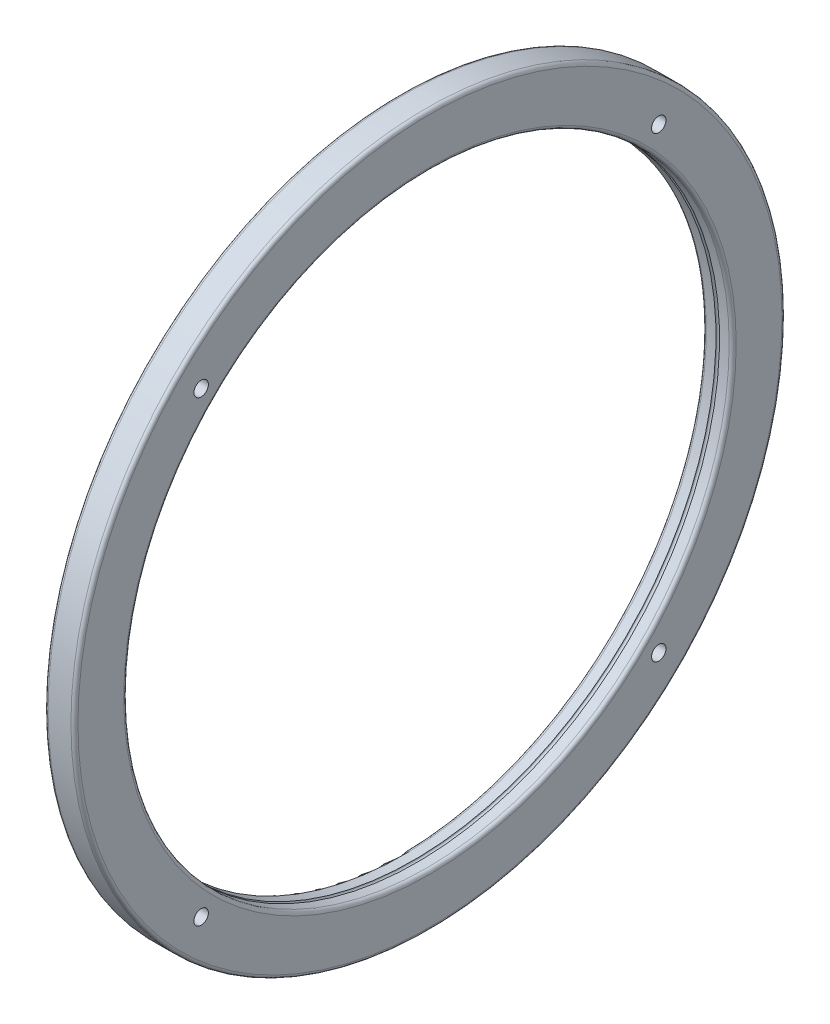
ISO-10303-21;
HEADER;
FILE_DESCRIPTION(('STEP AP214'),'2;1');
FILE_NAME('part.step','',(''),(''),'','','');
FILE_SCHEMA(('AUTOMOTIVE_DESIGN { 1 0 10303 214 1 1 1 1 }'));
ENDSEC;
DATA;
#1=APPLICATION_CONTEXT('core data for automotive mechanical design processes');
#2=APPLICATION_PROTOCOL_DEFINITION('international standard','automotive_design',2000,#1);
#3=PRODUCT_CONTEXT('',#1,'mechanical');
#4=PRODUCT('Part','Part','',(#3));
#5=PRODUCT_RELATED_PRODUCT_CATEGORY('part','',(#4));
#6=PRODUCT_DEFINITION_FORMATION('','',#4);
#7=PRODUCT_DEFINITION_CONTEXT('part definition',#1,'design');
#8=PRODUCT_DEFINITION('design','',#6,#7);
#9=PRODUCT_DEFINITION_SHAPE('','',#8);
#10=(LENGTH_UNIT() NAMED_UNIT(*) SI_UNIT(.MILLI.,.METRE.));
#11=(NAMED_UNIT(*) PLANE_ANGLE_UNIT() SI_UNIT($,.RADIAN.));
#12=(NAMED_UNIT(*) SI_UNIT($,.STERADIAN.) SOLID_ANGLE_UNIT());
#13=UNCERTAINTY_MEASURE_WITH_UNIT(LENGTH_MEASURE(1.E-05),#10,'distance_accuracy_value','');
#14=(GEOMETRIC_REPRESENTATION_CONTEXT(3) GLOBAL_UNCERTAINTY_ASSIGNED_CONTEXT((#13)) GLOBAL_UNIT_ASSIGNED_CONTEXT((#10,
#11,#12)) REPRESENTATION_CONTEXT('',''));
#15=CARTESIAN_POINT('',(0.,0.,0.));
#16=DIRECTION('',(0.,0.,1.));
#17=DIRECTION('',(1.,0.,0.));
#18=AXIS2_PLACEMENT_3D('',#15,#16,#17);
#19=CARTESIAN_POINT('',(0.00158686707756484,0.,0.));
#20=DIRECTION('',(-1.,0.,0.));
#21=DIRECTION('',(0.,0.,1.));
#22=AXIS2_PLACEMENT_3D('',#19,#20,#21);
#23=TOROIDAL_SURFACE('',#22,86.,0.5);
#24=CARTESIAN_POINT('',(-0.498413132922435,0.,0.));
#25=DIRECTION('',(-1.,0.,0.));
#26=DIRECTION('',(0.,0.,1.));
#27=AXIS2_PLACEMENT_3D('',#24,#25,#26);
#28=CIRCLE('',#27,86.);
#29=CARTESIAN_POINT('',(-0.498413132922435,0.,86.));
#30=VERTEX_POINT('',#29);
#31=EDGE_CURVE('E70',#30,#30,#28,.T.);
#32=ORIENTED_EDGE('',*,*,#31,.T.);
#33=EDGE_LOOP('',(#32));
#34=FACE_BOUND('',#33,.T.);
#35=CARTESIAN_POINT('',(0.501586867077565,0.,0.));
#36=DIRECTION('',(-1.,0.,0.));
#37=DIRECTION('',(0.,0.,1.));
#38=AXIS2_PLACEMENT_3D('',#35,#36,#37);
#39=CIRCLE('',#38,86.);
#40=CARTESIAN_POINT('',(0.501586867077565,0.,86.));
#41=VERTEX_POINT('',#40);
#42=EDGE_CURVE('E67',#41,#41,#39,.T.);
#43=ORIENTED_EDGE('',*,*,#42,.F.);
#44=EDGE_LOOP('',(#43));
#45=FACE_BOUND('',#44,.T.);
#46=ADVANCED_FACE('F35',(#34,#45),#23,.F.);
#47=CARTESIAN_POINT('',(0.,0.,0.));
#48=DIRECTION('',(-1.,0.,0.));
#49=DIRECTION('',(0.,0.,1.));
#50=AXIS2_PLACEMENT_3D('',#47,#48,#49);
#51=CYLINDRICAL_SURFACE('',#50,86.);
#52=CARTESIAN_POINT('',(3.25,0.,0.));
#53=DIRECTION('',(1.,0.,0.));
#54=DIRECTION('',(0.,0.,-1.));
#55=AXIS2_PLACEMENT_3D('',#52,#53,#54);
#56=CIRCLE('',#55,86.);
#57=CARTESIAN_POINT('',(3.25,0.,-86.));
#58=VERTEX_POINT('',#57);
#59=EDGE_CURVE('E46',#58,#58,#56,.T.);
#60=ORIENTED_EDGE('',*,*,#59,.T.);
#61=EDGE_LOOP('',(#60));
#62=FACE_BOUND('',#61,.T.);
#63=ORIENTED_EDGE('',*,*,#42,.T.);
#64=EDGE_LOOP('',(#63));
#65=FACE_BOUND('',#64,.T.);
#66=ADVANCED_FACE('F104',(#62,#65),#51,.F.);
#67=CARTESIAN_POINT('',(4.25,0.,-101.));
#68=DIRECTION('',(1.,0.,0.));
#69=DIRECTION('',(0.,0.,-1.));
#70=AXIS2_PLACEMENT_3D('',#67,#68,#69);
#71=PLANE('',#70);
#72=CARTESIAN_POINT('',(4.25,-65.0000000000007,-64.9999999999993));
#73=DIRECTION('',(1.,0.,0.));
#74=DIRECTION('',(0.,0.,-1.));
#75=AXIS2_PLACEMENT_3D('',#72,#73,#74);
#76=CIRCLE('',#75,2.04999999999999);
#77=CARTESIAN_POINT('',(4.25,-65.0000000000007,-67.0499999999993));
#78=VERTEX_POINT('',#77);
#79=EDGE_CURVE('E83',#78,#78,#76,.T.);
#80=ORIENTED_EDGE('',*,*,#79,.F.);
#81=EDGE_LOOP('',(#80));
#82=FACE_BOUND('',#81,.T.);
#83=CARTESIAN_POINT('',(4.25,64.9999999999995,-65.0000000000005));
#84=DIRECTION('',(1.,0.,0.));
#85=DIRECTION('',(0.,0.,-1.));
#86=AXIS2_PLACEMENT_3D('',#83,#84,#85);
#87=CIRCLE('',#86,2.05);
#88=CARTESIAN_POINT('',(4.25,64.9999999999995,-67.0500000000005));
#89=VERTEX_POINT('',#88);
#90=EDGE_CURVE('E89',#89,#89,#87,.T.);
#91=ORIENTED_EDGE('',*,*,#90,.F.);
#92=EDGE_LOOP('',(#91));
#93=FACE_BOUND('',#92,.T.);
#94=CARTESIAN_POINT('',(4.25,65.0000000000002,64.9999999999998));
#95=DIRECTION('',(1.,0.,0.));
#96=DIRECTION('',(0.,0.,-1.));
#97=AXIS2_PLACEMENT_3D('',#94,#95,#96);
#98=CIRCLE('',#97,2.04999999999999);
#99=CARTESIAN_POINT('',(4.25,65.0000000000002,62.9499999999998));
#100=VERTEX_POINT('',#99);
#101=EDGE_CURVE('E77',#100,#100,#98,.T.);
#102=ORIENTED_EDGE('',*,*,#101,.F.);
#103=EDGE_LOOP('',(#102));
#104=FACE_BOUND('',#103,.T.);
#105=CARTESIAN_POINT('',(4.25,-65.,65.));
#106=DIRECTION('',(1.,0.,0.));
#107=DIRECTION('',(0.,0.,-1.));
#108=AXIS2_PLACEMENT_3D('',#105,#106,#107);
#109=CIRCLE('',#108,2.04999999999999);
#110=CARTESIAN_POINT('',(4.25,-65.,62.95));
#111=VERTEX_POINT('',#110);
#112=EDGE_CURVE('E73',#111,#111,#109,.T.);
#113=ORIENTED_EDGE('',*,*,#112,.F.);
#114=EDGE_LOOP('',(#113));
#115=FACE_BOUND('',#114,.T.);
#116=CARTESIAN_POINT('',(4.25,0.,0.));
#117=DIRECTION('',(1.,0.,0.));
#118=DIRECTION('',(0.,0.,-1.));
#119=AXIS2_PLACEMENT_3D('',#116,#117,#118);
#120=CIRCLE('',#119,87.);
#121=CARTESIAN_POINT('',(4.25,0.,-87.));
#122=VERTEX_POINT('',#121);
#123=EDGE_CURVE('E50',#122,#122,#120,.F.);
#124=ORIENTED_EDGE('',*,*,#123,.T.);
#125=EDGE_LOOP('',(#124));
#126=FACE_BOUND('',#125,.T.);
#127=CARTESIAN_POINT('',(4.25,0.,0.));
#128=DIRECTION('',(1.,0.,0.));
#129=DIRECTION('',(0.,0.,-1.));
#130=AXIS2_PLACEMENT_3D('',#127,#128,#129);
#131=CIRCLE('',#130,100.);
#132=CARTESIAN_POINT('',(4.25,0.,-100.));
#133=VERTEX_POINT('',#132);
#134=EDGE_CURVE('E55',#133,#133,#131,.T.);
#135=ORIENTED_EDGE('',*,*,#134,.T.);
#136=EDGE_LOOP('',(#135));
#137=FACE_BOUND('',#136,.T.);
#138=ADVANCED_FACE('F100',(#82,#93,#104,#115,#126,#137),#71,.T.);
#139=CARTESIAN_POINT('',(0.,0.,0.));
#140=DIRECTION('',(-1.,0.,0.));
#141=DIRECTION('',(0.,0.,1.));
#142=AXIS2_PLACEMENT_3D('',#139,#140,#141);
#143=CYLINDRICAL_SURFACE('',#142,101.);
#144=CARTESIAN_POINT('',(3.25,0.,0.));
#145=DIRECTION('',(1.,0.,0.));
#146=DIRECTION('',(0.,0.,-1.));
#147=AXIS2_PLACEMENT_3D('',#144,#145,#146);
#148=CIRCLE('',#147,101.);
#149=CARTESIAN_POINT('',(3.25,0.,-101.));
#150=VERTEX_POINT('',#149);
#151=EDGE_CURVE('E10',#150,#150,#148,.F.);
#152=ORIENTED_EDGE('',*,*,#151,.T.);
#153=EDGE_LOOP('',(#152));
#154=FACE_BOUND('',#153,.T.);
#155=CARTESIAN_POINT('',(-3.25,0.,0.));
#156=DIRECTION('',(-1.,0.,0.));
#157=DIRECTION('',(0.,0.,1.));
#158=AXIS2_PLACEMENT_3D('',#155,#156,#157);
#159=CIRCLE('',#158,101.);
#160=CARTESIAN_POINT('',(-3.25,0.,101.));
#161=VERTEX_POINT('',#160);
#162=EDGE_CURVE('E42',#161,#161,#159,.F.);
#163=ORIENTED_EDGE('',*,*,#162,.T.);
#164=EDGE_LOOP('',(#163));
#165=FACE_BOUND('',#164,.T.);
#166=ADVANCED_FACE('F103',(#154,#165),#143,.T.);
#167=CARTESIAN_POINT('',(-4.25,0.,-86.));
#168=DIRECTION('',(-1.,0.,0.));
#169=DIRECTION('',(0.,0.,1.));
#170=AXIS2_PLACEMENT_3D('',#167,#168,#169);
#171=PLANE('',#170);
#172=CARTESIAN_POINT('',(-4.25,-65.0000000000007,-64.9999999999993));
#173=DIRECTION('',(-1.,0.,0.));
#174=DIRECTION('',(0.,0.,1.));
#175=AXIS2_PLACEMENT_3D('',#172,#173,#174);
#176=CIRCLE('',#175,2.04999999999999);
#177=CARTESIAN_POINT('',(-4.25,-65.0000000000007,-62.9499999999993));
#178=VERTEX_POINT('',#177);
#179=EDGE_CURVE('E80',#178,#178,#176,.F.);
#180=ORIENTED_EDGE('',*,*,#179,.T.);
#181=EDGE_LOOP('',(#180));
#182=FACE_BOUND('',#181,.T.);
#183=CARTESIAN_POINT('',(-4.25,64.9999999999995,-65.0000000000005));
#184=DIRECTION('',(-1.,0.,0.));
#185=DIRECTION('',(0.,0.,1.));
#186=AXIS2_PLACEMENT_3D('',#183,#184,#185);
#187=CIRCLE('',#186,2.05);
#188=CARTESIAN_POINT('',(-4.25,64.9999999999995,-62.9500000000005));
#189=VERTEX_POINT('',#188);
#190=EDGE_CURVE('E86',#189,#189,#187,.F.);
#191=ORIENTED_EDGE('',*,*,#190,.T.);
#192=EDGE_LOOP('',(#191));
#193=FACE_BOUND('',#192,.T.);
#194=CARTESIAN_POINT('',(-4.25,65.0000000000002,64.9999999999998));
#195=DIRECTION('',(-1.,0.,0.));
#196=DIRECTION('',(0.,0.,1.));
#197=AXIS2_PLACEMENT_3D('',#194,#195,#196);
#198=CIRCLE('',#197,2.04999999999999);
#199=CARTESIAN_POINT('',(-4.25,65.0000000000002,67.0499999999998));
#200=VERTEX_POINT('',#199);
#201=EDGE_CURVE('E92',#200,#200,#198,.F.);
#202=ORIENTED_EDGE('',*,*,#201,.T.);
#203=EDGE_LOOP('',(#202));
#204=FACE_BOUND('',#203,.T.);
#205=CARTESIAN_POINT('',(-4.25,-65.,65.));
#206=DIRECTION('',(-1.,0.,0.));
#207=DIRECTION('',(0.,0.,1.));
#208=AXIS2_PLACEMENT_3D('',#205,#206,#207);
#209=CIRCLE('',#208,2.04999999999999);
#210=CARTESIAN_POINT('',(-4.25,-65.,67.05));
#211=VERTEX_POINT('',#210);
#212=EDGE_CURVE('E74',#211,#211,#209,.F.);
#213=ORIENTED_EDGE('',*,*,#212,.T.);
#214=EDGE_LOOP('',(#213));
#215=FACE_BOUND('',#214,.T.);
#216=CARTESIAN_POINT('',(-4.25,0.,0.));
#217=DIRECTION('',(-1.,0.,0.));
#218=DIRECTION('',(0.,0.,1.));
#219=AXIS2_PLACEMENT_3D('',#216,#217,#218);
#220=CIRCLE('',#219,87.);
#221=CARTESIAN_POINT('',(-4.25,0.,87.));
#222=VERTEX_POINT('',#221);
#223=EDGE_CURVE('E58',#222,#222,#220,.F.);
#224=ORIENTED_EDGE('',*,*,#223,.T.);
#225=EDGE_LOOP('',(#224));
#226=FACE_BOUND('',#225,.T.);
#227=CARTESIAN_POINT('',(-4.25,0.,0.));
#228=DIRECTION('',(-1.,0.,0.));
#229=DIRECTION('',(0.,0.,1.));
#230=AXIS2_PLACEMENT_3D('',#227,#228,#229);
#231=CIRCLE('',#230,100.);
#232=CARTESIAN_POINT('',(-4.25,0.,100.));
#233=VERTEX_POINT('',#232);
#234=EDGE_CURVE('E61',#233,#233,#231,.T.);
#235=ORIENTED_EDGE('',*,*,#234,.T.);
#236=EDGE_LOOP('',(#235));
#237=FACE_BOUND('',#236,.T.);
#238=ADVANCED_FACE('F142',(#182,#193,#204,#215,#226,#237),#171,.T.);
#239=CARTESIAN_POINT('',(0.,0.,0.));
#240=DIRECTION('',(-1.,0.,0.));
#241=DIRECTION('',(0.,0.,1.));
#242=AXIS2_PLACEMENT_3D('',#239,#240,#241);
#243=CYLINDRICAL_SURFACE('',#242,86.);
#244=CARTESIAN_POINT('',(-3.25,0.,0.));
#245=DIRECTION('',(-1.,0.,0.));
#246=DIRECTION('',(0.,0.,1.));
#247=AXIS2_PLACEMENT_3D('',#244,#245,#246);
#248=CIRCLE('',#247,86.);
#249=CARTESIAN_POINT('',(-3.25,0.,86.));
#250=VERTEX_POINT('',#249);
#251=EDGE_CURVE('E64',#250,#250,#248,.T.);
#252=ORIENTED_EDGE('',*,*,#251,.T.);
#253=EDGE_LOOP('',(#252));
#254=FACE_BOUND('',#253,.T.);
#255=ORIENTED_EDGE('',*,*,#31,.F.);
#256=EDGE_LOOP('',(#255));
#257=FACE_BOUND('',#256,.T.);
#258=ADVANCED_FACE('F137',(#254,#257),#243,.F.);
#259=CARTESIAN_POINT('',(-3.25,0.,0.));
#260=DIRECTION('',(-1.,0.,0.));
#261=DIRECTION('',(0.,0.,1.));
#262=AXIS2_PLACEMENT_3D('',#259,#260,#261);
#263=TOROIDAL_SURFACE('',#262,87.,1.);
#264=ORIENTED_EDGE('',*,*,#223,.F.);
#265=EDGE_LOOP('',(#264));
#266=FACE_BOUND('',#265,.T.);
#267=ORIENTED_EDGE('',*,*,#251,.F.);
#268=EDGE_LOOP('',(#267));
#269=FACE_BOUND('',#268,.T.);
#270=ADVANCED_FACE('F123',(#266,#269),#263,.T.);
#271=CARTESIAN_POINT('',(3.25,0.,0.));
#272=DIRECTION('',(1.,0.,0.));
#273=DIRECTION('',(0.,0.,-1.));
#274=AXIS2_PLACEMENT_3D('',#271,#272,#273);
#275=TOROIDAL_SURFACE('',#274,87.,1.);
#276=ORIENTED_EDGE('',*,*,#59,.F.);
#277=EDGE_LOOP('',(#276));
#278=FACE_BOUND('',#277,.T.);
#279=ORIENTED_EDGE('',*,*,#123,.F.);
#280=EDGE_LOOP('',(#279));
#281=FACE_BOUND('',#280,.T.);
#282=ADVANCED_FACE('F116',(#278,#281),#275,.T.);
#283=CARTESIAN_POINT('',(3.25,0.,0.));
#284=DIRECTION('',(1.,0.,0.));
#285=DIRECTION('',(0.,0.,-1.));
#286=AXIS2_PLACEMENT_3D('',#283,#284,#285);
#287=TOROIDAL_SURFACE('',#286,100.,1.);
#288=ORIENTED_EDGE('',*,*,#134,.F.);
#289=EDGE_LOOP('',(#288));
#290=FACE_BOUND('',#289,.T.);
#291=ORIENTED_EDGE('',*,*,#151,.F.);
#292=EDGE_LOOP('',(#291));
#293=FACE_BOUND('',#292,.T.);
#294=ADVANCED_FACE('F113',(#290,#293),#287,.T.);
#295=CARTESIAN_POINT('',(-3.25,0.,0.));
#296=DIRECTION('',(-1.,0.,0.));
#297=DIRECTION('',(0.,0.,1.));
#298=AXIS2_PLACEMENT_3D('',#295,#296,#297);
#299=TOROIDAL_SURFACE('',#298,100.,1.);
#300=ORIENTED_EDGE('',*,*,#162,.F.);
#301=EDGE_LOOP('',(#300));
#302=FACE_BOUND('',#301,.T.);
#303=ORIENTED_EDGE('',*,*,#234,.F.);
#304=EDGE_LOOP('',(#303));
#305=FACE_BOUND('',#304,.T.);
#306=ADVANCED_FACE('F37',(#302,#305),#299,.T.);
#307=CARTESIAN_POINT('',(-4.251,-65.,65.));
#308=DIRECTION('',(1.,0.,0.));
#309=DIRECTION('',(0.,0.,-1.));
#310=AXIS2_PLACEMENT_3D('',#307,#308,#309);
#311=CYLINDRICAL_SURFACE('',#310,2.04999999999999);
#312=ORIENTED_EDGE('',*,*,#212,.F.);
#313=EDGE_LOOP('',(#312));
#314=FACE_BOUND('',#313,.T.);
#315=ORIENTED_EDGE('',*,*,#112,.T.);
#316=EDGE_LOOP('',(#315));
#317=FACE_BOUND('',#316,.T.);
#318=ADVANCED_FACE('F121',(#314,#317),#311,.F.);
#319=CARTESIAN_POINT('',(-4.251,65.0000000000002,64.9999999999998));
#320=DIRECTION('',(1.,0.,0.));
#321=DIRECTION('',(0.,0.,-1.));
#322=AXIS2_PLACEMENT_3D('',#319,#320,#321);
#323=CYLINDRICAL_SURFACE('',#322,2.04999999999999);
#324=ORIENTED_EDGE('',*,*,#201,.F.);
#325=EDGE_LOOP('',(#324));
#326=FACE_BOUND('',#325,.T.);
#327=ORIENTED_EDGE('',*,*,#101,.T.);
#328=EDGE_LOOP('',(#327));
#329=FACE_BOUND('',#328,.T.);
#330=ADVANCED_FACE('F98',(#326,#329),#323,.F.);
#331=CARTESIAN_POINT('',(-4.251,64.9999999999995,-65.0000000000005));
#332=DIRECTION('',(1.,0.,0.));
#333=DIRECTION('',(0.,0.,-1.));
#334=AXIS2_PLACEMENT_3D('',#331,#332,#333);
#335=CYLINDRICAL_SURFACE('',#334,2.05);
#336=ORIENTED_EDGE('',*,*,#190,.F.);
#337=EDGE_LOOP('',(#336));
#338=FACE_BOUND('',#337,.T.);
#339=ORIENTED_EDGE('',*,*,#90,.T.);
#340=EDGE_LOOP('',(#339));
#341=FACE_BOUND('',#340,.T.);
#342=ADVANCED_FACE('F169',(#338,#341),#335,.F.);
#343=CARTESIAN_POINT('',(-4.251,-65.0000000000007,-64.9999999999993));
#344=DIRECTION('',(1.,0.,0.));
#345=DIRECTION('',(0.,0.,-1.));
#346=AXIS2_PLACEMENT_3D('',#343,#344,#345);
#347=CYLINDRICAL_SURFACE('',#346,2.04999999999999);
#348=ORIENTED_EDGE('',*,*,#179,.F.);
#349=EDGE_LOOP('',(#348));
#350=FACE_BOUND('',#349,.T.);
#351=ORIENTED_EDGE('',*,*,#79,.T.);
#352=EDGE_LOOP('',(#351));
#353=FACE_BOUND('',#352,.T.);
#354=ADVANCED_FACE('F166',(#350,#353),#347,.F.);
#355=CLOSED_SHELL('',(#46,#66,#138,#166,#238,#258,#270,#282,#294,#306,#318,#330,#342,#354));
#356=MANIFOLD_SOLID_BREP('B2',#355);
#357=ADVANCED_BREP_SHAPE_REPRESENTATION('',(#18,#356),#14);
#358=SHAPE_DEFINITION_REPRESENTATION(#9,#357);
ENDSEC;
END-ISO-10303-21;
